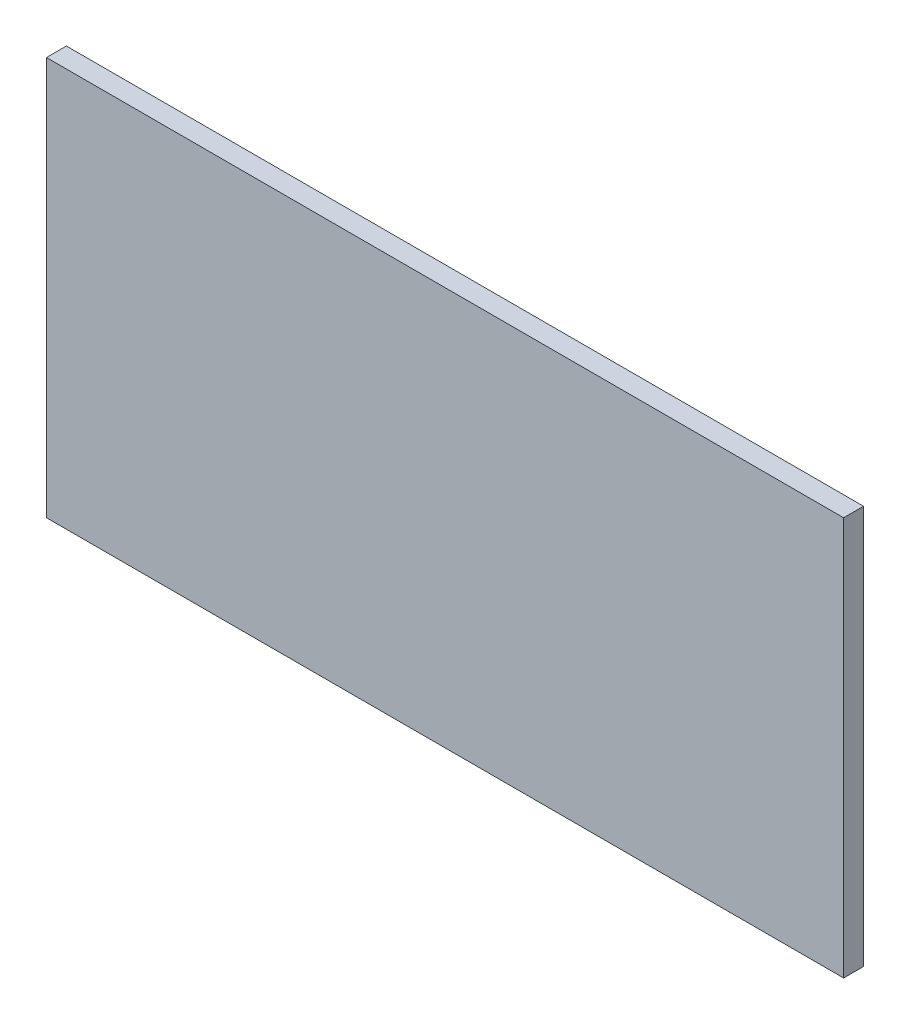
ISO-10303-21;
HEADER;
FILE_DESCRIPTION(('STEP AP214'),'2;1');
FILE_NAME('part.step','',(''),(''),'','','');
FILE_SCHEMA(('AUTOMOTIVE_DESIGN { 1 0 10303 214 1 1 1 1 }'));
ENDSEC;
DATA;
#1=APPLICATION_CONTEXT('core data for automotive mechanical design processes');
#2=APPLICATION_PROTOCOL_DEFINITION('international standard','automotive_design',2000,#1);
#3=PRODUCT_CONTEXT('',#1,'mechanical');
#4=PRODUCT('Part','Part','',(#3));
#5=PRODUCT_RELATED_PRODUCT_CATEGORY('part','',(#4));
#6=PRODUCT_DEFINITION_FORMATION('','',#4);
#7=PRODUCT_DEFINITION_CONTEXT('part definition',#1,'design');
#8=PRODUCT_DEFINITION('design','',#6,#7);
#9=PRODUCT_DEFINITION_SHAPE('','',#8);
#10=(LENGTH_UNIT() NAMED_UNIT(*) SI_UNIT(.MILLI.,.METRE.));
#11=(NAMED_UNIT(*) PLANE_ANGLE_UNIT() SI_UNIT($,.RADIAN.));
#12=(NAMED_UNIT(*) SI_UNIT($,.STERADIAN.) SOLID_ANGLE_UNIT());
#13=UNCERTAINTY_MEASURE_WITH_UNIT(LENGTH_MEASURE(1.E-05),#10,'distance_accuracy_value','');
#14=(GEOMETRIC_REPRESENTATION_CONTEXT(3) GLOBAL_UNCERTAINTY_ASSIGNED_CONTEXT((#13)) GLOBAL_UNIT_ASSIGNED_CONTEXT((#10,
#11,#12)) REPRESENTATION_CONTEXT('',''));
#15=CARTESIAN_POINT('',(0.,0.,0.));
#16=DIRECTION('',(0.,0.,1.));
#17=DIRECTION('',(1.,0.,0.));
#18=AXIS2_PLACEMENT_3D('',#15,#16,#17);
#19=CARTESIAN_POINT('',(63.5,31.75,3.175));
#20=DIRECTION('',(-1.,0.,0.));
#21=DIRECTION('',(0.,-1.,0.));
#22=AXIS2_PLACEMENT_3D('',#19,#20,#21);
#23=PLANE('',#22);
#24=DIRECTION('',(0.,1.,0.));
#25=VECTOR('',#24,1.);
#26=CARTESIAN_POINT('',(63.5,31.75,0.));
#27=LINE('',#26,#25);
#28=CARTESIAN_POINT('',(63.5,-31.75,0.));
#29=VERTEX_POINT('',#28);
#30=CARTESIAN_POINT('',(63.5,31.75,0.));
#31=VERTEX_POINT('',#30);
#32=EDGE_CURVE('E107',#29,#31,#27,.T.);
#33=ORIENTED_EDGE('',*,*,#32,.T.);
#34=DIRECTION('',(0.,0.,-1.));
#35=VECTOR('',#34,1.);
#36=CARTESIAN_POINT('',(63.5,31.75,3.175));
#37=LINE('',#36,#35);
#38=CARTESIAN_POINT('',(63.5,31.75,3.175));
#39=VERTEX_POINT('',#38);
#40=EDGE_CURVE('E11',#39,#31,#37,.T.);
#41=ORIENTED_EDGE('',*,*,#40,.F.);
#42=DIRECTION('',(0.,1.,0.));
#43=VECTOR('',#42,1.);
#44=CARTESIAN_POINT('',(63.5,31.75,3.175));
#45=LINE('',#44,#43);
#46=CARTESIAN_POINT('',(63.5,-31.75,3.175));
#47=VERTEX_POINT('',#46);
#48=EDGE_CURVE('E91',#47,#39,#45,.T.);
#49=ORIENTED_EDGE('',*,*,#48,.F.);
#50=DIRECTION('',(0.,0.,-1.));
#51=VECTOR('',#50,1.);
#52=CARTESIAN_POINT('',(63.5,-31.75,3.175));
#53=LINE('',#52,#51);
#54=EDGE_CURVE('E103',#47,#29,#53,.T.);
#55=ORIENTED_EDGE('',*,*,#54,.T.);
#56=EDGE_LOOP('',(#33,#41,#49,#55));
#57=FACE_BOUND('',#56,.T.);
#58=ADVANCED_FACE('F39',(#57),#23,.F.);
#59=CARTESIAN_POINT('',(-63.5,31.75,3.175));
#60=DIRECTION('',(0.,-1.,0.));
#61=DIRECTION('',(0.,0.,-1.));
#62=AXIS2_PLACEMENT_3D('',#59,#60,#61);
#63=PLANE('',#62);
#64=DIRECTION('',(-1.,0.,0.));
#65=VECTOR('',#64,1.);
#66=CARTESIAN_POINT('',(-63.5,31.75,0.));
#67=LINE('',#66,#65);
#68=CARTESIAN_POINT('',(-63.5,31.75,0.));
#69=VERTEX_POINT('',#68);
#70=EDGE_CURVE('E96',#31,#69,#67,.T.);
#71=ORIENTED_EDGE('',*,*,#70,.T.);
#72=DIRECTION('',(0.,0.,-1.));
#73=VECTOR('',#72,1.);
#74=CARTESIAN_POINT('',(-63.5,31.75,3.175));
#75=LINE('',#74,#73);
#76=CARTESIAN_POINT('',(-63.5,31.75,3.175));
#77=VERTEX_POINT('',#76);
#78=EDGE_CURVE('E48',#77,#69,#75,.T.);
#79=ORIENTED_EDGE('',*,*,#78,.F.);
#80=DIRECTION('',(-1.,0.,0.));
#81=VECTOR('',#80,1.);
#82=CARTESIAN_POINT('',(-63.5,31.75,3.175));
#83=LINE('',#82,#81);
#84=EDGE_CURVE('E86',#39,#77,#83,.T.);
#85=ORIENTED_EDGE('',*,*,#84,.F.);
#86=ORIENTED_EDGE('',*,*,#40,.T.);
#87=EDGE_LOOP('',(#71,#79,#85,#86));
#88=FACE_BOUND('',#87,.T.);
#89=ADVANCED_FACE('F95',(#88),#63,.F.);
#90=CARTESIAN_POINT('',(-63.5,31.75,3.175));
#91=DIRECTION('',(1.,0.,0.));
#92=DIRECTION('',(0.,1.,0.));
#93=AXIS2_PLACEMENT_3D('',#90,#91,#92);
#94=PLANE('',#93);
#95=DIRECTION('',(0.,-1.,0.));
#96=VECTOR('',#95,1.);
#97=CARTESIAN_POINT('',(-63.5,31.75,0.));
#98=LINE('',#97,#96);
#99=CARTESIAN_POINT('',(-63.5,-31.75,0.));
#100=VERTEX_POINT('',#99);
#101=EDGE_CURVE('E73',#69,#100,#98,.T.);
#102=ORIENTED_EDGE('',*,*,#101,.T.);
#103=DIRECTION('',(0.,0.,-1.));
#104=VECTOR('',#103,1.);
#105=CARTESIAN_POINT('',(-63.5,-31.75,3.175));
#106=LINE('',#105,#104);
#107=CARTESIAN_POINT('',(-63.5,-31.75,3.175));
#108=VERTEX_POINT('',#107);
#109=EDGE_CURVE('E98',#108,#100,#106,.T.);
#110=ORIENTED_EDGE('',*,*,#109,.F.);
#111=DIRECTION('',(0.,-1.,0.));
#112=VECTOR('',#111,1.);
#113=CARTESIAN_POINT('',(-63.5,31.75,3.175));
#114=LINE('',#113,#112);
#115=EDGE_CURVE('E89',#77,#108,#114,.T.);
#116=ORIENTED_EDGE('',*,*,#115,.F.);
#117=ORIENTED_EDGE('',*,*,#78,.T.);
#118=EDGE_LOOP('',(#102,#110,#116,#117));
#119=FACE_BOUND('',#118,.T.);
#120=ADVANCED_FACE('F99',(#119),#94,.F.);
#121=CARTESIAN_POINT('',(-63.5,-31.75,3.175));
#122=DIRECTION('',(0.,1.,0.));
#123=DIRECTION('',(0.,0.,1.));
#124=AXIS2_PLACEMENT_3D('',#121,#122,#123);
#125=PLANE('',#124);
#126=DIRECTION('',(1.,0.,0.));
#127=VECTOR('',#126,1.);
#128=CARTESIAN_POINT('',(-63.5,-31.75,0.));
#129=LINE('',#128,#127);
#130=EDGE_CURVE('E79',#100,#29,#129,.T.);
#131=ORIENTED_EDGE('',*,*,#130,.T.);
#132=ORIENTED_EDGE('',*,*,#54,.F.);
#133=DIRECTION('',(1.,0.,0.));
#134=VECTOR('',#133,1.);
#135=CARTESIAN_POINT('',(-63.5,-31.75,3.175));
#136=LINE('',#135,#134);
#137=EDGE_CURVE('E56',#108,#47,#136,.T.);
#138=ORIENTED_EDGE('',*,*,#137,.F.);
#139=ORIENTED_EDGE('',*,*,#109,.T.);
#140=EDGE_LOOP('',(#131,#132,#138,#139));
#141=FACE_BOUND('',#140,.T.);
#142=ADVANCED_FACE('F120',(#141),#125,.F.);
#143=CARTESIAN_POINT('',(0.,0.,3.175));
#144=DIRECTION('',(0.,0.,1.));
#145=DIRECTION('',(1.,0.,0.));
#146=AXIS2_PLACEMENT_3D('',#143,#144,#145);
#147=PLANE('',#146);
#148=ORIENTED_EDGE('',*,*,#48,.T.);
#149=ORIENTED_EDGE('',*,*,#84,.T.);
#150=ORIENTED_EDGE('',*,*,#115,.T.);
#151=ORIENTED_EDGE('',*,*,#137,.T.);
#152=EDGE_LOOP('',(#148,#149,#150,#151));
#153=FACE_BOUND('',#152,.T.);
#154=ADVANCED_FACE('F87',(#153),#147,.T.);
#155=CARTESIAN_POINT('',(0.,0.,0.));
#156=DIRECTION('',(0.,0.,1.));
#157=DIRECTION('',(1.,0.,0.));
#158=AXIS2_PLACEMENT_3D('',#155,#156,#157);
#159=PLANE('',#158);
#160=ORIENTED_EDGE('',*,*,#32,.F.);
#161=ORIENTED_EDGE('',*,*,#130,.F.);
#162=ORIENTED_EDGE('',*,*,#101,.F.);
#163=ORIENTED_EDGE('',*,*,#70,.F.);
#164=EDGE_LOOP('',(#160,#161,#162,#163));
#165=FACE_BOUND('',#164,.T.);
#166=ADVANCED_FACE('F123',(#165),#159,.F.);
#167=CLOSED_SHELL('',(#58,#89,#120,#142,#154,#166));
#168=MANIFOLD_SOLID_BREP('B2',#167);
#169=ADVANCED_BREP_SHAPE_REPRESENTATION('',(#18,#168),#14);
#170=SHAPE_DEFINITION_REPRESENTATION(#9,#169);
ENDSEC;
END-ISO-10303-21;
